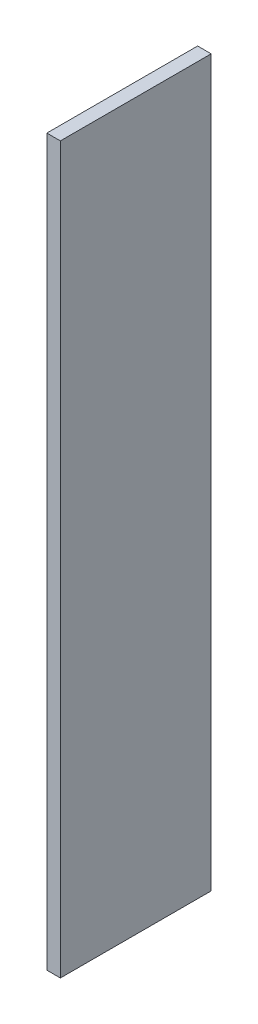
ISO-10303-21;
HEADER;
FILE_DESCRIPTION(('STEP AP214'),'2;1');
FILE_NAME('part.step','',(''),(''),'','','');
FILE_SCHEMA(('AUTOMOTIVE_DESIGN { 1 0 10303 214 1 1 1 1 }'));
ENDSEC;
DATA;
#1=APPLICATION_CONTEXT('core data for automotive mechanical design processes');
#2=APPLICATION_PROTOCOL_DEFINITION('international standard','automotive_design',2000,#1);
#3=PRODUCT_CONTEXT('',#1,'mechanical');
#4=PRODUCT('Part','Part','',(#3));
#5=PRODUCT_RELATED_PRODUCT_CATEGORY('part','',(#4));
#6=PRODUCT_DEFINITION_FORMATION('','',#4);
#7=PRODUCT_DEFINITION_CONTEXT('part definition',#1,'design');
#8=PRODUCT_DEFINITION('design','',#6,#7);
#9=PRODUCT_DEFINITION_SHAPE('','',#8);
#10=(LENGTH_UNIT() NAMED_UNIT(*) SI_UNIT(.MILLI.,.METRE.));
#11=(NAMED_UNIT(*) PLANE_ANGLE_UNIT() SI_UNIT($,.RADIAN.));
#12=(NAMED_UNIT(*) SI_UNIT($,.STERADIAN.) SOLID_ANGLE_UNIT());
#13=UNCERTAINTY_MEASURE_WITH_UNIT(LENGTH_MEASURE(1.E-05),#10,'distance_accuracy_value','');
#14=(GEOMETRIC_REPRESENTATION_CONTEXT(3) GLOBAL_UNCERTAINTY_ASSIGNED_CONTEXT((#13)) GLOBAL_UNIT_ASSIGNED_CONTEXT((#10,
#11,#12)) REPRESENTATION_CONTEXT('',''));
#15=CARTESIAN_POINT('',(0.,0.,0.));
#16=DIRECTION('',(0.,0.,1.));
#17=DIRECTION('',(1.,0.,0.));
#18=AXIS2_PLACEMENT_3D('',#15,#16,#17);
#19=CARTESIAN_POINT('',(1.4,-37.5,-7.8));
#20=DIRECTION('',(0.,0.,1.));
#21=DIRECTION('',(1.,0.,0.));
#22=AXIS2_PLACEMENT_3D('',#19,#20,#21);
#23=PLANE('',#22);
#24=DIRECTION('',(0.,1.,0.));
#25=VECTOR('',#24,1.);
#26=CARTESIAN_POINT('',(0.,-37.5,-7.8));
#27=LINE('',#26,#25);
#28=CARTESIAN_POINT('',(0.,-37.5,-7.8));
#29=VERTEX_POINT('',#28);
#30=CARTESIAN_POINT('',(0.,37.5,-7.8));
#31=VERTEX_POINT('',#30);
#32=EDGE_CURVE('E113',#29,#31,#27,.T.);
#33=ORIENTED_EDGE('',*,*,#32,.T.);
#34=DIRECTION('',(-1.,0.,0.));
#35=VECTOR('',#34,1.);
#36=CARTESIAN_POINT('',(1.4,37.5,-7.8));
#37=LINE('',#36,#35);
#38=CARTESIAN_POINT('',(1.4,37.5,-7.8));
#39=VERTEX_POINT('',#38);
#40=EDGE_CURVE('E11',#39,#31,#37,.T.);
#41=ORIENTED_EDGE('',*,*,#40,.F.);
#42=DIRECTION('',(0.,1.,0.));
#43=VECTOR('',#42,1.);
#44=CARTESIAN_POINT('',(1.4,-37.5,-7.8));
#45=LINE('',#44,#43);
#46=CARTESIAN_POINT('',(1.4,-37.5,-7.8));
#47=VERTEX_POINT('',#46);
#48=EDGE_CURVE('E97',#47,#39,#45,.T.);
#49=ORIENTED_EDGE('',*,*,#48,.F.);
#50=DIRECTION('',(-1.,0.,0.));
#51=VECTOR('',#50,1.);
#52=CARTESIAN_POINT('',(1.4,-37.5,-7.8));
#53=LINE('',#52,#51);
#54=EDGE_CURVE('E109',#47,#29,#53,.T.);
#55=ORIENTED_EDGE('',*,*,#54,.T.);
#56=EDGE_LOOP('',(#33,#41,#49,#55));
#57=FACE_BOUND('',#56,.T.);
#58=ADVANCED_FACE('F45',(#57),#23,.F.);
#59=CARTESIAN_POINT('',(1.4,37.5,7.8));
#60=DIRECTION('',(0.,-1.,0.));
#61=DIRECTION('',(0.,0.,-1.));
#62=AXIS2_PLACEMENT_3D('',#59,#60,#61);
#63=PLANE('',#62);
#64=DIRECTION('',(0.,0.,1.));
#65=VECTOR('',#64,1.);
#66=CARTESIAN_POINT('',(0.,37.5,7.8));
#67=LINE('',#66,#65);
#68=CARTESIAN_POINT('',(0.,37.5,7.8));
#69=VERTEX_POINT('',#68);
#70=EDGE_CURVE('E102',#31,#69,#67,.T.);
#71=ORIENTED_EDGE('',*,*,#70,.T.);
#72=DIRECTION('',(-1.,0.,0.));
#73=VECTOR('',#72,1.);
#74=CARTESIAN_POINT('',(1.4,37.5,7.8));
#75=LINE('',#74,#73);
#76=CARTESIAN_POINT('',(1.4,37.5,7.8));
#77=VERTEX_POINT('',#76);
#78=EDGE_CURVE('E54',#77,#69,#75,.T.);
#79=ORIENTED_EDGE('',*,*,#78,.F.);
#80=DIRECTION('',(0.,0.,1.));
#81=VECTOR('',#80,1.);
#82=CARTESIAN_POINT('',(1.4,37.5,7.8));
#83=LINE('',#82,#81);
#84=EDGE_CURVE('E92',#39,#77,#83,.T.);
#85=ORIENTED_EDGE('',*,*,#84,.F.);
#86=ORIENTED_EDGE('',*,*,#40,.T.);
#87=EDGE_LOOP('',(#71,#79,#85,#86));
#88=FACE_BOUND('',#87,.T.);
#89=ADVANCED_FACE('F101',(#88),#63,.F.);
#90=CARTESIAN_POINT('',(1.4,-37.5,7.8));
#91=DIRECTION('',(0.,0.,-1.));
#92=DIRECTION('',(-1.,0.,0.));
#93=AXIS2_PLACEMENT_3D('',#90,#91,#92);
#94=PLANE('',#93);
#95=DIRECTION('',(0.,-1.,0.));
#96=VECTOR('',#95,1.);
#97=CARTESIAN_POINT('',(0.,-37.5,7.8));
#98=LINE('',#97,#96);
#99=CARTESIAN_POINT('',(0.,-37.5,7.8));
#100=VERTEX_POINT('',#99);
#101=EDGE_CURVE('E79',#69,#100,#98,.T.);
#102=ORIENTED_EDGE('',*,*,#101,.T.);
#103=DIRECTION('',(-1.,0.,0.));
#104=VECTOR('',#103,1.);
#105=CARTESIAN_POINT('',(1.4,-37.5,7.8));
#106=LINE('',#105,#104);
#107=CARTESIAN_POINT('',(1.4,-37.5,7.8));
#108=VERTEX_POINT('',#107);
#109=EDGE_CURVE('E104',#108,#100,#106,.T.);
#110=ORIENTED_EDGE('',*,*,#109,.F.);
#111=DIRECTION('',(0.,-1.,0.));
#112=VECTOR('',#111,1.);
#113=CARTESIAN_POINT('',(1.4,-37.5,7.8));
#114=LINE('',#113,#112);
#115=EDGE_CURVE('E95',#77,#108,#114,.T.);
#116=ORIENTED_EDGE('',*,*,#115,.F.);
#117=ORIENTED_EDGE('',*,*,#78,.T.);
#118=EDGE_LOOP('',(#102,#110,#116,#117));
#119=FACE_BOUND('',#118,.T.);
#120=ADVANCED_FACE('F105',(#119),#94,.F.);
#121=CARTESIAN_POINT('',(1.4,-37.5,7.8));
#122=DIRECTION('',(0.,1.,0.));
#123=DIRECTION('',(0.,0.,1.));
#124=AXIS2_PLACEMENT_3D('',#121,#122,#123);
#125=PLANE('',#124);
#126=DIRECTION('',(0.,0.,-1.));
#127=VECTOR('',#126,1.);
#128=CARTESIAN_POINT('',(0.,-37.5,7.8));
#129=LINE('',#128,#127);
#130=EDGE_CURVE('E85',#100,#29,#129,.T.);
#131=ORIENTED_EDGE('',*,*,#130,.T.);
#132=ORIENTED_EDGE('',*,*,#54,.F.);
#133=DIRECTION('',(0.,0.,-1.));
#134=VECTOR('',#133,1.);
#135=CARTESIAN_POINT('',(1.4,-37.5,7.8));
#136=LINE('',#135,#134);
#137=EDGE_CURVE('E62',#108,#47,#136,.T.);
#138=ORIENTED_EDGE('',*,*,#137,.F.);
#139=ORIENTED_EDGE('',*,*,#109,.T.);
#140=EDGE_LOOP('',(#131,#132,#138,#139));
#141=FACE_BOUND('',#140,.T.);
#142=ADVANCED_FACE('F126',(#141),#125,.F.);
#143=CARTESIAN_POINT('',(1.4,0.,0.));
#144=DIRECTION('',(-1.,0.,0.));
#145=DIRECTION('',(0.,0.,1.));
#146=AXIS2_PLACEMENT_3D('',#143,#144,#145);
#147=PLANE('',#146);
#148=ORIENTED_EDGE('',*,*,#48,.T.);
#149=ORIENTED_EDGE('',*,*,#84,.T.);
#150=ORIENTED_EDGE('',*,*,#115,.T.);
#151=ORIENTED_EDGE('',*,*,#137,.T.);
#152=EDGE_LOOP('',(#148,#149,#150,#151));
#153=FACE_BOUND('',#152,.T.);
#154=ADVANCED_FACE('F93',(#153),#147,.F.);
#155=CARTESIAN_POINT('',(0.,0.,0.));
#156=DIRECTION('',(-1.,0.,0.));
#157=DIRECTION('',(0.,0.,1.));
#158=AXIS2_PLACEMENT_3D('',#155,#156,#157);
#159=PLANE('',#158);
#160=ORIENTED_EDGE('',*,*,#32,.F.);
#161=ORIENTED_EDGE('',*,*,#130,.F.);
#162=ORIENTED_EDGE('',*,*,#101,.F.);
#163=ORIENTED_EDGE('',*,*,#70,.F.);
#164=EDGE_LOOP('',(#160,#161,#162,#163));
#165=FACE_BOUND('',#164,.T.);
#166=ADVANCED_FACE('F129',(#165),#159,.T.);
#167=CLOSED_SHELL('',(#58,#89,#120,#142,#154,#166));
#168=MANIFOLD_SOLID_BREP('B2',#167);
#169=ADVANCED_BREP_SHAPE_REPRESENTATION('',(#18,#168),#14);
#170=SHAPE_DEFINITION_REPRESENTATION(#9,#169);
ENDSEC;
END-ISO-10303-21;
